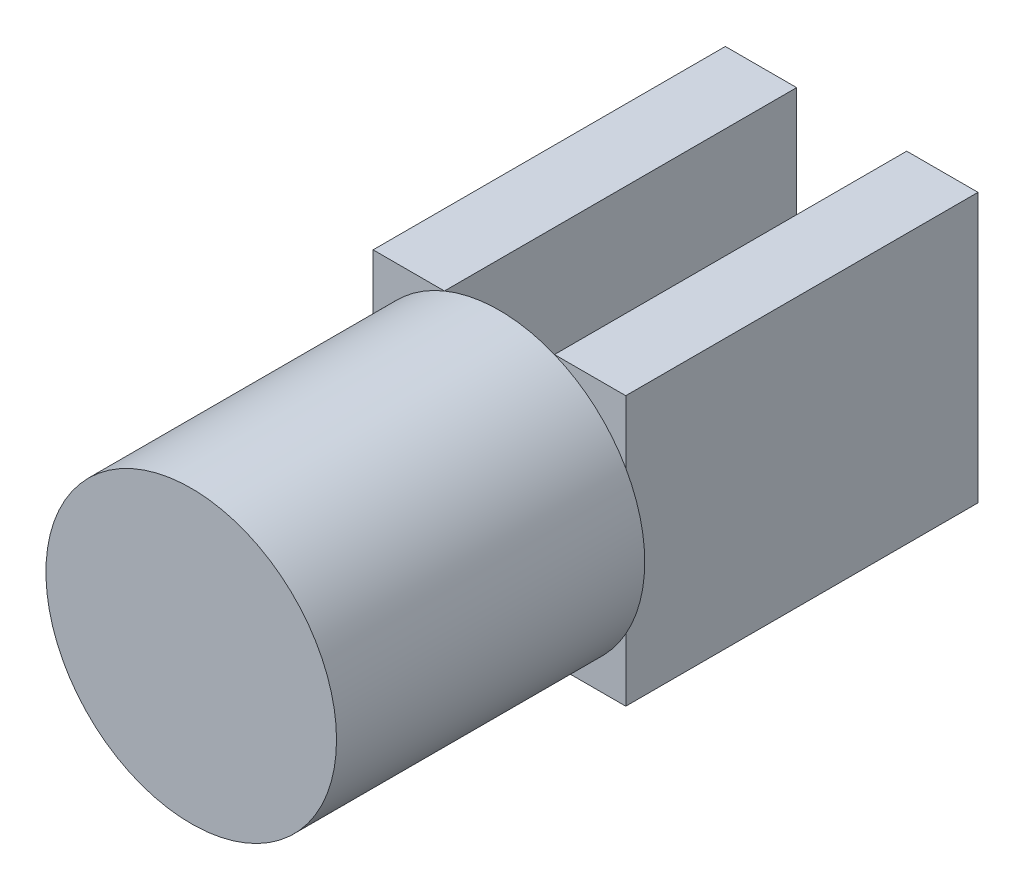
ISO-10303-21;
HEADER;
FILE_DESCRIPTION(('STEP AP214'),'2;1');
FILE_NAME('part.step','',(''),(''),'','','');
FILE_SCHEMA(('AUTOMOTIVE_DESIGN { 1 0 10303 214 1 1 1 1 }'));
ENDSEC;
DATA;
#1=APPLICATION_CONTEXT('core data for automotive mechanical design processes');
#2=APPLICATION_PROTOCOL_DEFINITION('international standard','automotive_design',2000,#1);
#3=PRODUCT_CONTEXT('',#1,'mechanical');
#4=PRODUCT('Part','Part','',(#3));
#5=PRODUCT_RELATED_PRODUCT_CATEGORY('part','',(#4));
#6=PRODUCT_DEFINITION_FORMATION('','',#4);
#7=PRODUCT_DEFINITION_CONTEXT('part definition',#1,'design');
#8=PRODUCT_DEFINITION('design','',#6,#7);
#9=PRODUCT_DEFINITION_SHAPE('','',#8);
#10=(LENGTH_UNIT() NAMED_UNIT(*) SI_UNIT(.MILLI.,.METRE.));
#11=(NAMED_UNIT(*) PLANE_ANGLE_UNIT() SI_UNIT($,.RADIAN.));
#12=(NAMED_UNIT(*) SI_UNIT($,.STERADIAN.) SOLID_ANGLE_UNIT());
#13=UNCERTAINTY_MEASURE_WITH_UNIT(LENGTH_MEASURE(1.E-05),#10,'distance_accuracy_value','');
#14=(GEOMETRIC_REPRESENTATION_CONTEXT(3) GLOBAL_UNCERTAINTY_ASSIGNED_CONTEXT((#13)) GLOBAL_UNIT_ASSIGNED_CONTEXT((#10,
#11,#12)) REPRESENTATION_CONTEXT('',''));
#15=CARTESIAN_POINT('',(0.,0.,0.));
#16=DIRECTION('',(0.,0.,1.));
#17=DIRECTION('',(1.,0.,0.));
#18=AXIS2_PLACEMENT_3D('',#15,#16,#17);
#19=CARTESIAN_POINT('',(0.,0.,0.));
#20=DIRECTION('',(0.,0.,1.));
#21=DIRECTION('',(1.,0.,0.));
#22=AXIS2_PLACEMENT_3D('',#19,#20,#21);
#23=PLANE('',#22);
#24=DIRECTION('',(0.,-1.,0.));
#25=VECTOR('',#24,1.);
#26=CARTESIAN_POINT('',(-12.5,30.5409561081509,0.));
#27=LINE('',#26,#25);
#28=CARTESIAN_POINT('',(-12.5,30.5409561081509,0.));
#29=VERTEX_POINT('',#28);
#30=CARTESIAN_POINT('',(-12.5,-30.5409561081509,0.));
#31=VERTEX_POINT('',#30);
#32=EDGE_CURVE('E134',#29,#31,#27,.T.);
#33=ORIENTED_EDGE('',*,*,#32,.F.);
#34=CARTESIAN_POINT('',(0.,0.,0.));
#35=DIRECTION('',(0.,0.,1.));
#36=DIRECTION('',(1.,0.,0.));
#37=AXIS2_PLACEMENT_3D('',#34,#35,#36);
#38=CIRCLE('',#37,33.);
#39=CARTESIAN_POINT('',(12.5,30.5409561081509,0.));
#40=VERTEX_POINT('',#39);
#41=EDGE_CURVE('E124',#40,#29,#38,.T.);
#42=ORIENTED_EDGE('',*,*,#41,.F.);
#43=DIRECTION('',(0.,-1.,0.));
#44=VECTOR('',#43,1.);
#45=CARTESIAN_POINT('',(12.5,30.5409561081509,0.));
#46=LINE('',#45,#44);
#47=CARTESIAN_POINT('',(12.5,-30.5409561081509,0.));
#48=VERTEX_POINT('',#47);
#49=EDGE_CURVE('E147',#40,#48,#46,.T.);
#50=ORIENTED_EDGE('',*,*,#49,.T.);
#51=EDGE_CURVE('E58',#31,#48,#38,.T.);
#52=ORIENTED_EDGE('',*,*,#51,.F.);
#53=EDGE_LOOP('',(#33,#42,#50,#52));
#54=FACE_BOUND('',#53,.T.);
#55=ADVANCED_FACE('F35',(#54),#23,.F.);
#56=DIRECTION('',(0.,-1.,0.));
#57=VECTOR('',#56,1.);
#58=CARTESIAN_POINT('',(28.6905653042879,30.5409561081509,0.));
#59=LINE('',#58,#57);
#60=CARTESIAN_POINT('',(28.6905653042879,16.3049520858048,0.));
#61=VERTEX_POINT('',#60);
#62=CARTESIAN_POINT('',(28.6905653042879,-16.3049520858048,0.));
#63=VERTEX_POINT('',#62);
#64=EDGE_CURVE('E43',#61,#63,#59,.T.);
#65=ORIENTED_EDGE('',*,*,#64,.F.);
#66=EDGE_CURVE('E126',#63,#61,#38,.T.);
#67=ORIENTED_EDGE('',*,*,#66,.F.);
#68=EDGE_LOOP('',(#65,#67));
#69=FACE_BOUND('',#68,.T.);
#70=ADVANCED_FACE('F240',(#69),#23,.F.);
#71=CARTESIAN_POINT('',(0.,0.,70.));
#72=DIRECTION('',(0.,0.,-1.));
#73=DIRECTION('',(-1.,0.,0.));
#74=AXIS2_PLACEMENT_3D('',#71,#72,#73);
#75=CYLINDRICAL_SURFACE('',#74,33.);
#76=CARTESIAN_POINT('',(0.,0.,70.));
#77=DIRECTION('',(0.,0.,1.));
#78=DIRECTION('',(1.,0.,0.));
#79=AXIS2_PLACEMENT_3D('',#76,#77,#78);
#80=CIRCLE('',#79,33.);
#81=CARTESIAN_POINT('',(33.,0.,70.));
#82=VERTEX_POINT('',#81);
#83=EDGE_CURVE('E155',#82,#82,#80,.T.);
#84=ORIENTED_EDGE('',*,*,#83,.F.);
#85=EDGE_LOOP('',(#84));
#86=FACE_BOUND('',#85,.T.);
#87=EDGE_CURVE('E152',#61,#40,#38,.T.);
#88=ORIENTED_EDGE('',*,*,#87,.T.);
#89=ORIENTED_EDGE('',*,*,#41,.T.);
#90=CARTESIAN_POINT('',(-28.6905653042879,16.3049520858048,0.));
#91=VERTEX_POINT('',#90);
#92=EDGE_CURVE('E114',#29,#91,#38,.T.);
#93=ORIENTED_EDGE('',*,*,#92,.T.);
#94=CARTESIAN_POINT('',(-28.6905653042879,-16.3049520858048,0.));
#95=VERTEX_POINT('',#94);
#96=EDGE_CURVE('E125',#91,#95,#38,.T.);
#97=ORIENTED_EDGE('',*,*,#96,.T.);
#98=EDGE_CURVE('E159',#95,#31,#38,.T.);
#99=ORIENTED_EDGE('',*,*,#98,.T.);
#100=ORIENTED_EDGE('',*,*,#51,.T.);
#101=EDGE_CURVE('E154',#48,#63,#38,.T.);
#102=ORIENTED_EDGE('',*,*,#101,.T.);
#103=ORIENTED_EDGE('',*,*,#66,.T.);
#104=EDGE_LOOP('',(#88,#89,#93,#97,#99,#100,#102,#103));
#105=FACE_BOUND('',#104,.T.);
#106=ADVANCED_FACE('F37',(#86,#105),#75,.T.);
#107=CARTESIAN_POINT('',(0.,0.,70.));
#108=DIRECTION('',(0.,0.,1.));
#109=DIRECTION('',(1.,0.,0.));
#110=AXIS2_PLACEMENT_3D('',#107,#108,#109);
#111=PLANE('',#110);
#112=ORIENTED_EDGE('',*,*,#83,.T.);
#113=EDGE_LOOP('',(#112));
#114=FACE_BOUND('',#113,.T.);
#115=ADVANCED_FACE('F248',(#114),#111,.T.);
#116=ORIENTED_EDGE('',*,*,#96,.F.);
#117=DIRECTION('',(0.,-1.,0.));
#118=VECTOR('',#117,1.);
#119=CARTESIAN_POINT('',(-28.6905653042879,0.,0.));
#120=LINE('',#119,#118);
#121=EDGE_CURVE('E11',#91,#95,#120,.T.);
#122=ORIENTED_EDGE('',*,*,#121,.T.);
#123=EDGE_LOOP('',(#116,#122));
#124=FACE_BOUND('',#123,.T.);
#125=ADVANCED_FACE('F227',(#124),#23,.F.);
#126=CARTESIAN_POINT('',(0.,0.,0.));
#127=DIRECTION('',(0.,0.,1.));
#128=DIRECTION('',(1.,0.,0.));
#129=AXIS2_PLACEMENT_3D('',#126,#127,#128);
#130=PLANE('',#129);
#131=ORIENTED_EDGE('',*,*,#87,.F.);
#132=CARTESIAN_POINT('',(28.6905653042879,30.5409561081509,0.));
#133=VERTEX_POINT('',#132);
#134=EDGE_CURVE('E182',#133,#61,#59,.T.);
#135=ORIENTED_EDGE('',*,*,#134,.F.);
#136=DIRECTION('',(1.,0.,0.));
#137=VECTOR('',#136,1.);
#138=CARTESIAN_POINT('',(12.5,30.5409561081509,0.));
#139=LINE('',#138,#137);
#140=EDGE_CURVE('E170',#40,#133,#139,.T.);
#141=ORIENTED_EDGE('',*,*,#140,.F.);
#142=EDGE_LOOP('',(#131,#135,#141));
#143=FACE_BOUND('',#142,.T.);
#144=ADVANCED_FACE('F247',(#143),#130,.T.);
#145=ORIENTED_EDGE('',*,*,#101,.F.);
#146=DIRECTION('',(1.,0.,0.));
#147=VECTOR('',#146,1.);
#148=CARTESIAN_POINT('',(12.5,-30.5409561081509,0.));
#149=LINE('',#148,#147);
#150=CARTESIAN_POINT('',(28.6905653042879,-30.5409561081509,0.));
#151=VERTEX_POINT('',#150);
#152=EDGE_CURVE('E187',#48,#151,#149,.T.);
#153=ORIENTED_EDGE('',*,*,#152,.T.);
#154=EDGE_CURVE('E183',#63,#151,#59,.T.);
#155=ORIENTED_EDGE('',*,*,#154,.F.);
#156=EDGE_LOOP('',(#145,#153,#155));
#157=FACE_BOUND('',#156,.T.);
#158=ADVANCED_FACE('F253',(#157),#130,.T.);
#159=CARTESIAN_POINT('',(12.5,30.5409561081509,-80.));
#160=DIRECTION('',(-1.,0.,0.));
#161=DIRECTION('',(0.,0.,1.));
#162=AXIS2_PLACEMENT_3D('',#159,#160,#161);
#163=PLANE('',#162);
#164=ORIENTED_EDGE('',*,*,#49,.F.);
#165=DIRECTION('',(0.,0.,1.));
#166=VECTOR('',#165,1.);
#167=CARTESIAN_POINT('',(12.5,30.5409561081509,-80.));
#168=LINE('',#167,#166);
#169=CARTESIAN_POINT('',(12.5,30.5409561081509,-80.));
#170=VERTEX_POINT('',#169);
#171=EDGE_CURVE('E160',#170,#40,#168,.T.);
#172=ORIENTED_EDGE('',*,*,#171,.F.);
#173=DIRECTION('',(0.,-1.,0.));
#174=VECTOR('',#173,1.);
#175=CARTESIAN_POINT('',(12.5,30.5409561081509,-80.));
#176=LINE('',#175,#174);
#177=CARTESIAN_POINT('',(12.5,-30.5409561081509,-80.));
#178=VERTEX_POINT('',#177);
#179=EDGE_CURVE('E201',#170,#178,#176,.T.);
#180=ORIENTED_EDGE('',*,*,#179,.T.);
#181=DIRECTION('',(0.,0.,1.));
#182=VECTOR('',#181,1.);
#183=CARTESIAN_POINT('',(12.5,-30.5409561081509,-80.));
#184=LINE('',#183,#182);
#185=EDGE_CURVE('E175',#178,#48,#184,.T.);
#186=ORIENTED_EDGE('',*,*,#185,.T.);
#187=EDGE_LOOP('',(#164,#172,#180,#186));
#188=FACE_BOUND('',#187,.T.);
#189=ADVANCED_FACE('F261',(#188),#163,.T.);
#190=CARTESIAN_POINT('',(12.5,30.5409561081509,-80.));
#191=DIRECTION('',(0.,-1.,0.));
#192=DIRECTION('',(0.,0.,-1.));
#193=AXIS2_PLACEMENT_3D('',#190,#191,#192);
#194=PLANE('',#193);
#195=ORIENTED_EDGE('',*,*,#140,.T.);
#196=DIRECTION('',(0.,0.,1.));
#197=VECTOR('',#196,1.);
#198=CARTESIAN_POINT('',(28.6905653042879,30.5409561081509,-80.));
#199=LINE('',#198,#197);
#200=CARTESIAN_POINT('',(28.6905653042879,30.5409561081509,-80.));
#201=VERTEX_POINT('',#200);
#202=EDGE_CURVE('E161',#201,#133,#199,.T.);
#203=ORIENTED_EDGE('',*,*,#202,.F.);
#204=DIRECTION('',(1.,0.,0.));
#205=VECTOR('',#204,1.);
#206=CARTESIAN_POINT('',(12.5,30.5409561081509,-80.));
#207=LINE('',#206,#205);
#208=EDGE_CURVE('E177',#170,#201,#207,.T.);
#209=ORIENTED_EDGE('',*,*,#208,.F.);
#210=ORIENTED_EDGE('',*,*,#171,.T.);
#211=EDGE_LOOP('',(#195,#203,#209,#210));
#212=FACE_BOUND('',#211,.T.);
#213=ADVANCED_FACE('F264',(#212),#194,.F.);
#214=CARTESIAN_POINT('',(28.6905653042879,30.5409561081509,-80.));
#215=DIRECTION('',(-1.,0.,0.));
#216=DIRECTION('',(0.,0.,1.));
#217=AXIS2_PLACEMENT_3D('',#214,#215,#216);
#218=PLANE('',#217);
#219=ORIENTED_EDGE('',*,*,#134,.T.);
#220=ORIENTED_EDGE('',*,*,#64,.T.);
#221=ORIENTED_EDGE('',*,*,#154,.T.);
#222=DIRECTION('',(0.,0.,1.));
#223=VECTOR('',#222,1.);
#224=CARTESIAN_POINT('',(28.6905653042879,-30.5409561081509,-80.));
#225=LINE('',#224,#223);
#226=CARTESIAN_POINT('',(28.6905653042879,-30.5409561081509,-80.));
#227=VERTEX_POINT('',#226);
#228=EDGE_CURVE('E167',#227,#151,#225,.T.);
#229=ORIENTED_EDGE('',*,*,#228,.F.);
#230=DIRECTION('',(0.,-1.,0.));
#231=VECTOR('',#230,1.);
#232=CARTESIAN_POINT('',(28.6905653042879,30.5409561081509,-80.));
#233=LINE('',#232,#231);
#234=EDGE_CURVE('E196',#201,#227,#233,.T.);
#235=ORIENTED_EDGE('',*,*,#234,.F.);
#236=ORIENTED_EDGE('',*,*,#202,.T.);
#237=EDGE_LOOP('',(#219,#220,#221,#229,#235,#236));
#238=FACE_BOUND('',#237,.T.);
#239=ADVANCED_FACE('F269',(#238),#218,.F.);
#240=CARTESIAN_POINT('',(12.5,-30.5409561081509,-80.));
#241=DIRECTION('',(0.,-1.,0.));
#242=DIRECTION('',(0.,0.,-1.));
#243=AXIS2_PLACEMENT_3D('',#240,#241,#242);
#244=PLANE('',#243);
#245=ORIENTED_EDGE('',*,*,#152,.F.);
#246=ORIENTED_EDGE('',*,*,#185,.F.);
#247=DIRECTION('',(1.,0.,0.));
#248=VECTOR('',#247,1.);
#249=CARTESIAN_POINT('',(12.5,-30.5409561081509,-80.));
#250=LINE('',#249,#248);
#251=EDGE_CURVE('E198',#178,#227,#250,.T.);
#252=ORIENTED_EDGE('',*,*,#251,.T.);
#253=ORIENTED_EDGE('',*,*,#228,.T.);
#254=EDGE_LOOP('',(#245,#246,#252,#253));
#255=FACE_BOUND('',#254,.T.);
#256=ADVANCED_FACE('F266',(#255),#244,.T.);
#257=CARTESIAN_POINT('',(0.,0.,-80.));
#258=DIRECTION('',(0.,0.,1.));
#259=DIRECTION('',(1.,0.,0.));
#260=AXIS2_PLACEMENT_3D('',#257,#258,#259);
#261=PLANE('',#260);
#262=ORIENTED_EDGE('',*,*,#179,.F.);
#263=ORIENTED_EDGE('',*,*,#208,.T.);
#264=ORIENTED_EDGE('',*,*,#234,.T.);
#265=ORIENTED_EDGE('',*,*,#251,.F.);
#266=EDGE_LOOP('',(#262,#263,#264,#265));
#267=FACE_BOUND('',#266,.T.);
#268=ADVANCED_FACE('F238',(#267),#261,.F.);
#269=CARTESIAN_POINT('',(0.,0.,0.));
#270=DIRECTION('',(0.,0.,-1.));
#271=DIRECTION('',(-1.,0.,0.));
#272=AXIS2_PLACEMENT_3D('',#269,#270,#271);
#273=PLANE('',#272);
#274=DIRECTION('',(0.,-1.,0.));
#275=VECTOR('',#274,1.);
#276=CARTESIAN_POINT('',(-28.6905653042879,30.5409561081509,0.));
#277=LINE('',#276,#275);
#278=CARTESIAN_POINT('',(-28.6905653042879,30.5409561081509,0.));
#279=VERTEX_POINT('',#278);
#280=EDGE_CURVE('E120',#279,#91,#277,.T.);
#281=ORIENTED_EDGE('',*,*,#280,.T.);
#282=ORIENTED_EDGE('',*,*,#92,.F.);
#283=DIRECTION('',(-1.,0.,0.));
#284=VECTOR('',#283,1.);
#285=CARTESIAN_POINT('',(-12.5,30.5409561081509,0.));
#286=LINE('',#285,#284);
#287=EDGE_CURVE('E118',#29,#279,#286,.T.);
#288=ORIENTED_EDGE('',*,*,#287,.T.);
#289=EDGE_LOOP('',(#281,#282,#288));
#290=FACE_BOUND('',#289,.T.);
#291=ADVANCED_FACE('F116',(#290),#273,.F.);
#292=CARTESIAN_POINT('',(-12.5,30.5409561081509,-80.));
#293=DIRECTION('',(-1.,0.,0.));
#294=DIRECTION('',(0.,0.,1.));
#295=AXIS2_PLACEMENT_3D('',#292,#293,#294);
#296=PLANE('',#295);
#297=ORIENTED_EDGE('',*,*,#32,.T.);
#298=DIRECTION('',(0.,0.,1.));
#299=VECTOR('',#298,1.);
#300=CARTESIAN_POINT('',(-12.5,-30.5409561081509,-80.));
#301=LINE('',#300,#299);
#302=CARTESIAN_POINT('',(-12.5,-30.5409561081509,-80.));
#303=VERTEX_POINT('',#302);
#304=EDGE_CURVE('E217',#303,#31,#301,.T.);
#305=ORIENTED_EDGE('',*,*,#304,.F.);
#306=DIRECTION('',(0.,-1.,0.));
#307=VECTOR('',#306,1.);
#308=CARTESIAN_POINT('',(-12.5,30.5409561081509,-80.));
#309=LINE('',#308,#307);
#310=CARTESIAN_POINT('',(-12.5,30.5409561081509,-80.));
#311=VERTEX_POINT('',#310);
#312=EDGE_CURVE('E136',#311,#303,#309,.T.);
#313=ORIENTED_EDGE('',*,*,#312,.F.);
#314=DIRECTION('',(0.,0.,1.));
#315=VECTOR('',#314,1.);
#316=CARTESIAN_POINT('',(-12.5,30.5409561081509,-80.));
#317=LINE('',#316,#315);
#318=EDGE_CURVE('E130',#311,#29,#317,.T.);
#319=ORIENTED_EDGE('',*,*,#318,.T.);
#320=EDGE_LOOP('',(#297,#305,#313,#319));
#321=FACE_BOUND('',#320,.T.);
#322=ADVANCED_FACE('F131',(#321),#296,.F.);
#323=CARTESIAN_POINT('',(-12.5,-30.5409561081509,-80.));
#324=DIRECTION('',(0.,1.,0.));
#325=DIRECTION('',(0.,0.,1.));
#326=AXIS2_PLACEMENT_3D('',#323,#324,#325);
#327=PLANE('',#326);
#328=DIRECTION('',(-1.,0.,0.));
#329=VECTOR('',#328,1.);
#330=CARTESIAN_POINT('',(-12.5,-30.5409561081509,0.));
#331=LINE('',#330,#329);
#332=CARTESIAN_POINT('',(-28.6905653042879,-30.5409561081509,0.));
#333=VERTEX_POINT('',#332);
#334=EDGE_CURVE('E148',#31,#333,#331,.T.);
#335=ORIENTED_EDGE('',*,*,#334,.T.);
#336=DIRECTION('',(0.,0.,1.));
#337=VECTOR('',#336,1.);
#338=CARTESIAN_POINT('',(-28.6905653042879,-30.5409561081509,-80.));
#339=LINE('',#338,#337);
#340=CARTESIAN_POINT('',(-28.6905653042879,-30.5409561081509,-80.));
#341=VERTEX_POINT('',#340);
#342=EDGE_CURVE('E215',#341,#333,#339,.T.);
#343=ORIENTED_EDGE('',*,*,#342,.F.);
#344=DIRECTION('',(-1.,0.,0.));
#345=VECTOR('',#344,1.);
#346=CARTESIAN_POINT('',(-12.5,-30.5409561081509,-80.));
#347=LINE('',#346,#345);
#348=EDGE_CURVE('E205',#303,#341,#347,.T.);
#349=ORIENTED_EDGE('',*,*,#348,.F.);
#350=ORIENTED_EDGE('',*,*,#304,.T.);
#351=EDGE_LOOP('',(#335,#343,#349,#350));
#352=FACE_BOUND('',#351,.T.);
#353=ADVANCED_FACE('F220',(#352),#327,.F.);
#354=CARTESIAN_POINT('',(-28.6905653042879,30.5409561081509,-80.));
#355=DIRECTION('',(-1.,0.,0.));
#356=DIRECTION('',(0.,0.,1.));
#357=AXIS2_PLACEMENT_3D('',#354,#355,#356);
#358=PLANE('',#357);
#359=ORIENTED_EDGE('',*,*,#280,.F.);
#360=DIRECTION('',(0.,0.,1.));
#361=VECTOR('',#360,1.);
#362=CARTESIAN_POINT('',(-28.6905653042879,30.5409561081509,-80.));
#363=LINE('',#362,#361);
#364=CARTESIAN_POINT('',(-28.6905653042879,30.5409561081509,-80.));
#365=VERTEX_POINT('',#364);
#366=EDGE_CURVE('E141',#365,#279,#363,.T.);
#367=ORIENTED_EDGE('',*,*,#366,.F.);
#368=DIRECTION('',(0.,-1.,0.));
#369=VECTOR('',#368,1.);
#370=CARTESIAN_POINT('',(-28.6905653042879,30.5409561081509,-80.));
#371=LINE('',#370,#369);
#372=EDGE_CURVE('E207',#365,#341,#371,.T.);
#373=ORIENTED_EDGE('',*,*,#372,.T.);
#374=ORIENTED_EDGE('',*,*,#342,.T.);
#375=EDGE_CURVE('E50',#95,#333,#277,.T.);
#376=ORIENTED_EDGE('',*,*,#375,.F.);
#377=ORIENTED_EDGE('',*,*,#121,.F.);
#378=EDGE_LOOP('',(#359,#367,#373,#374,#376,#377));
#379=FACE_BOUND('',#378,.T.);
#380=ADVANCED_FACE('F225',(#379),#358,.T.);
#381=CARTESIAN_POINT('',(-12.5,30.5409561081509,-80.));
#382=DIRECTION('',(0.,1.,0.));
#383=DIRECTION('',(0.,0.,1.));
#384=AXIS2_PLACEMENT_3D('',#381,#382,#383);
#385=PLANE('',#384);
#386=ORIENTED_EDGE('',*,*,#287,.F.);
#387=ORIENTED_EDGE('',*,*,#318,.F.);
#388=DIRECTION('',(-1.,0.,0.));
#389=VECTOR('',#388,1.);
#390=CARTESIAN_POINT('',(-12.5,30.5409561081509,-80.));
#391=LINE('',#390,#389);
#392=EDGE_CURVE('E140',#311,#365,#391,.T.);
#393=ORIENTED_EDGE('',*,*,#392,.T.);
#394=ORIENTED_EDGE('',*,*,#366,.T.);
#395=EDGE_LOOP('',(#386,#387,#393,#394));
#396=FACE_BOUND('',#395,.T.);
#397=ADVANCED_FACE('F143',(#396),#385,.T.);
#398=CARTESIAN_POINT('',(0.,0.,-80.));
#399=DIRECTION('',(0.,0.,-1.));
#400=DIRECTION('',(-1.,0.,0.));
#401=AXIS2_PLACEMENT_3D('',#398,#399,#400);
#402=PLANE('',#401);
#403=ORIENTED_EDGE('',*,*,#312,.T.);
#404=ORIENTED_EDGE('',*,*,#348,.T.);
#405=ORIENTED_EDGE('',*,*,#372,.F.);
#406=ORIENTED_EDGE('',*,*,#392,.F.);
#407=EDGE_LOOP('',(#403,#404,#405,#406));
#408=FACE_BOUND('',#407,.T.);
#409=ADVANCED_FACE('F224',(#408),#402,.T.);
#410=ORIENTED_EDGE('',*,*,#334,.F.);
#411=ORIENTED_EDGE('',*,*,#98,.F.);
#412=ORIENTED_EDGE('',*,*,#375,.T.);
#413=EDGE_LOOP('',(#410,#411,#412));
#414=FACE_BOUND('',#413,.T.);
#415=ADVANCED_FACE('F229',(#414),#273,.F.);
#416=CLOSED_SHELL('',(#55,#70,#106,#115,#125,#144,#158,#189,#213,#239,#256,#268,#291,#322,#353,
#380,#397,#409,#415));
#417=MANIFOLD_SOLID_BREP('B2',#416);
#418=ADVANCED_BREP_SHAPE_REPRESENTATION('',(#18,#417),#14);
#419=SHAPE_DEFINITION_REPRESENTATION(#9,#418);
ENDSEC;
END-ISO-10303-21;
